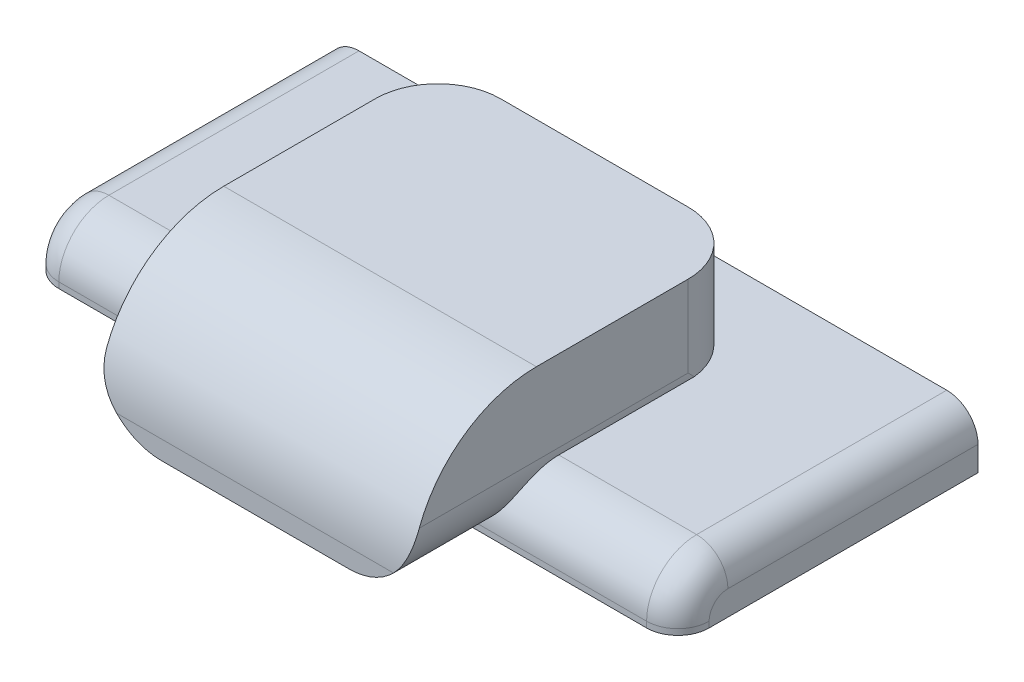
ISO-10303-21;
HEADER;
FILE_DESCRIPTION(('STEP AP214'),'2;1');
FILE_NAME('part.step','',(''),(''),'','','');
FILE_SCHEMA(('AUTOMOTIVE_DESIGN { 1 0 10303 214 1 1 1 1 }'));
ENDSEC;
DATA;
#1=APPLICATION_CONTEXT('core data for automotive mechanical design processes');
#2=APPLICATION_PROTOCOL_DEFINITION('international standard','automotive_design',2000,#1);
#3=PRODUCT_CONTEXT('',#1,'mechanical');
#4=PRODUCT('Part','Part','',(#3));
#5=PRODUCT_RELATED_PRODUCT_CATEGORY('part','',(#4));
#6=PRODUCT_DEFINITION_FORMATION('','',#4);
#7=PRODUCT_DEFINITION_CONTEXT('part definition',#1,'design');
#8=PRODUCT_DEFINITION('design','',#6,#7);
#9=PRODUCT_DEFINITION_SHAPE('','',#8);
#10=(LENGTH_UNIT() NAMED_UNIT(*) SI_UNIT(.MILLI.,.METRE.));
#11=(NAMED_UNIT(*) PLANE_ANGLE_UNIT() SI_UNIT($,.RADIAN.));
#12=(NAMED_UNIT(*) SI_UNIT($,.STERADIAN.) SOLID_ANGLE_UNIT());
#13=UNCERTAINTY_MEASURE_WITH_UNIT(LENGTH_MEASURE(1.E-05),#10,'distance_accuracy_value','');
#14=(GEOMETRIC_REPRESENTATION_CONTEXT(3) GLOBAL_UNCERTAINTY_ASSIGNED_CONTEXT((#13)) GLOBAL_UNIT_ASSIGNED_CONTEXT((#10,
#11,#12)) REPRESENTATION_CONTEXT('',''));
#15=CARTESIAN_POINT('',(0.,0.,0.));
#16=DIRECTION('',(0.,0.,1.));
#17=DIRECTION('',(1.,0.,0.));
#18=AXIS2_PLACEMENT_3D('',#15,#16,#17);
#19=CARTESIAN_POINT('',(3.175,2.921,3.444875));
#20=DIRECTION('',(-1.,0.,0.));
#21=DIRECTION('',(0.,0.,1.));
#22=AXIS2_PLACEMENT_3D('',#19,#20,#21);
#23=PLANE('',#22);
#24=DIRECTION('',(0.,0.,-1.));
#25=VECTOR('',#24,1.);
#26=CARTESIAN_POINT('',(3.175,1.27,1.4605));
#27=LINE('',#26,#25);
#28=CARTESIAN_POINT('',(3.175,1.27,3.28421923738979));
#29=VERTEX_POINT('',#28);
#30=CARTESIAN_POINT('',(3.175,1.27,-2.174875));
#31=VERTEX_POINT('',#30);
#32=EDGE_CURVE('E296',#29,#31,#27,.T.);
#33=ORIENTED_EDGE('',*,*,#32,.T.);
#34=DIRECTION('',(0.,-1.,0.));
#35=VECTOR('',#34,1.);
#36=CARTESIAN_POINT('',(3.175,2.921,-2.174875));
#37=LINE('',#36,#35);
#38=CARTESIAN_POINT('',(3.175,2.921,-2.174875));
#39=VERTEX_POINT('',#38);
#40=EDGE_CURVE('E443',#31,#39,#37,.F.);
#41=ORIENTED_EDGE('',*,*,#40,.T.);
#42=DIRECTION('',(0.,0.,-1.));
#43=VECTOR('',#42,1.);
#44=CARTESIAN_POINT('',(3.175,2.921,3.444875));
#45=LINE('',#44,#43);
#46=CARTESIAN_POINT('',(3.175,2.921,0.904875000000001));
#47=VERTEX_POINT('',#46);
#48=EDGE_CURVE('E274',#47,#39,#45,.T.);
#49=ORIENTED_EDGE('',*,*,#48,.F.);
#50=CARTESIAN_POINT('',(3.175,0.381,0.904875));
#51=DIRECTION('',(-1.,0.,0.));
#52=DIRECTION('',(0.,0.,1.));
#53=AXIS2_PLACEMENT_3D('',#50,#51,#52);
#54=CIRCLE('',#53,2.54);
#55=EDGE_CURVE('E287',#47,#29,#54,.F.);
#56=ORIENTED_EDGE('',*,*,#55,.T.);
#57=EDGE_LOOP('',(#33,#41,#49,#56));
#58=FACE_BOUND('',#57,.T.);
#59=ADVANCED_FACE('F37',(#58),#23,.F.);
#60=CARTESIAN_POINT('',(-3.175,2.921,-3.444875));
#61=DIRECTION('',(0.,0.,1.));
#62=DIRECTION('',(1.,0.,0.));
#63=AXIS2_PLACEMENT_3D('',#60,#61,#62);
#64=PLANE('',#63);
#65=DIRECTION('',(1.,0.,0.));
#66=VECTOR('',#65,1.);
#67=CARTESIAN_POINT('',(-3.175,1.1350625,-3.444875));
#68=LINE('',#67,#66);
#69=CARTESIAN_POINT('',(-1.905,1.1350625,-3.444875));
#70=VERTEX_POINT('',#69);
#71=CARTESIAN_POINT('',(1.905,1.1350625,-3.444875));
#72=VERTEX_POINT('',#71);
#73=EDGE_CURVE('E260',#70,#72,#68,.T.);
#74=ORIENTED_EDGE('',*,*,#73,.F.);
#75=DIRECTION('',(0.,-1.,0.));
#76=VECTOR('',#75,1.);
#77=CARTESIAN_POINT('',(-1.905,2.921,-3.444875));
#78=LINE('',#77,#76);
#79=CARTESIAN_POINT('',(-1.905,2.921,-3.444875));
#80=VERTEX_POINT('',#79);
#81=EDGE_CURVE('E451',#70,#80,#78,.F.);
#82=ORIENTED_EDGE('',*,*,#81,.T.);
#83=DIRECTION('',(-1.,0.,0.));
#84=VECTOR('',#83,1.);
#85=CARTESIAN_POINT('',(-3.175,2.921,-3.444875));
#86=LINE('',#85,#84);
#87=CARTESIAN_POINT('',(1.905,2.921,-3.444875));
#88=VERTEX_POINT('',#87);
#89=EDGE_CURVE('E277',#88,#80,#86,.T.);
#90=ORIENTED_EDGE('',*,*,#89,.F.);
#91=DIRECTION('',(0.,-1.,0.));
#92=VECTOR('',#91,1.);
#93=CARTESIAN_POINT('',(1.905,2.921,-3.444875));
#94=LINE('',#93,#92);
#95=EDGE_CURVE('E453',#88,#72,#94,.T.);
#96=ORIENTED_EDGE('',*,*,#95,.T.);
#97=EDGE_LOOP('',(#74,#82,#90,#96));
#98=FACE_BOUND('',#97,.T.);
#99=ADVANCED_FACE('F471',(#98),#64,.F.);
#100=CARTESIAN_POINT('',(-3.175,2.921,3.444875));
#101=DIRECTION('',(1.,0.,0.));
#102=DIRECTION('',(0.,0.,-1.));
#103=AXIS2_PLACEMENT_3D('',#100,#101,#102);
#104=PLANE('',#103);
#105=DIRECTION('',(0.,0.,1.));
#106=VECTOR('',#105,1.);
#107=CARTESIAN_POINT('',(-3.175,2.921,3.444875));
#108=LINE('',#107,#106);
#109=CARTESIAN_POINT('',(-3.175,2.921,-2.174875));
#110=VERTEX_POINT('',#109);
#111=CARTESIAN_POINT('',(-3.175,2.921,0.904875000000001));
#112=VERTEX_POINT('',#111);
#113=EDGE_CURVE('E280',#110,#112,#108,.T.);
#114=ORIENTED_EDGE('',*,*,#113,.F.);
#115=DIRECTION('',(0.,-1.,0.));
#116=VECTOR('',#115,1.);
#117=CARTESIAN_POINT('',(-3.175,2.921,-2.174875));
#118=LINE('',#117,#116);
#119=CARTESIAN_POINT('',(-3.175,1.27,-2.174875));
#120=VERTEX_POINT('',#119);
#121=EDGE_CURVE('E457',#110,#120,#118,.T.);
#122=ORIENTED_EDGE('',*,*,#121,.T.);
#123=DIRECTION('',(0.,0.,1.));
#124=VECTOR('',#123,1.);
#125=CARTESIAN_POINT('',(-3.175,1.27,3.444875));
#126=LINE('',#125,#124);
#127=CARTESIAN_POINT('',(-3.175,1.27,3.28421923738979));
#128=VERTEX_POINT('',#127);
#129=EDGE_CURVE('E485',#120,#128,#126,.T.);
#130=ORIENTED_EDGE('',*,*,#129,.T.);
#131=CARTESIAN_POINT('',(-3.175,0.381,0.904875));
#132=DIRECTION('',(1.,0.,0.));
#133=DIRECTION('',(0.,0.,-1.));
#134=AXIS2_PLACEMENT_3D('',#131,#132,#133);
#135=CIRCLE('',#134,2.54);
#136=EDGE_CURVE('E293',#128,#112,#135,.F.);
#137=ORIENTED_EDGE('',*,*,#136,.T.);
#138=EDGE_LOOP('',(#114,#122,#130,#137));
#139=FACE_BOUND('',#138,.T.);
#140=ADVANCED_FACE('F497',(#139),#104,.F.);
#141=CARTESIAN_POINT('',(-3.175,2.921,3.444875));
#142=DIRECTION('',(0.,0.,-1.));
#143=DIRECTION('',(-1.,0.,0.));
#144=AXIS2_PLACEMENT_3D('',#141,#142,#143);
#145=PLANE('',#144);
#146=DIRECTION('',(1.,0.,0.));
#147=VECTOR('',#146,1.);
#148=CARTESIAN_POINT('',(-3.175,0.,3.444875));
#149=LINE('',#148,#147);
#150=CARTESIAN_POINT('',(-1.905,0.,3.444875));
#151=VERTEX_POINT('',#150);
#152=CARTESIAN_POINT('',(1.905,0.,3.444875));
#153=VERTEX_POINT('',#152);
#154=EDGE_CURVE('E273',#151,#153,#149,.T.);
#155=ORIENTED_EDGE('',*,*,#154,.T.);
#156=CARTESIAN_POINT('',(1.905,1.27,3.444875));
#157=DIRECTION('',(0.,0.,-1.));
#158=DIRECTION('',(-1.,0.,0.));
#159=AXIS2_PLACEMENT_3D('',#156,#157,#158);
#160=CIRCLE('',#159,1.27);
#161=CARTESIAN_POINT('',(2.81196141042494,0.381,3.444875));
#162=VERTEX_POINT('',#161);
#163=EDGE_CURVE('E306',#153,#162,#160,.F.);
#164=ORIENTED_EDGE('',*,*,#163,.T.);
#165=DIRECTION('',(1.,0.,0.));
#166=VECTOR('',#165,1.);
#167=CARTESIAN_POINT('',(-3.175,0.381,3.444875));
#168=LINE('',#167,#166);
#169=CARTESIAN_POINT('',(-2.81196141042494,0.381,3.444875));
#170=VERTEX_POINT('',#169);
#171=EDGE_CURVE('E290',#162,#170,#168,.F.);
#172=ORIENTED_EDGE('',*,*,#171,.T.);
#173=CARTESIAN_POINT('',(-1.905,1.27,3.444875));
#174=DIRECTION('',(0.,0.,-1.));
#175=DIRECTION('',(-1.,0.,0.));
#176=AXIS2_PLACEMENT_3D('',#173,#174,#175);
#177=CIRCLE('',#176,1.27);
#178=EDGE_CURVE('E304',#170,#151,#177,.F.);
#179=ORIENTED_EDGE('',*,*,#178,.T.);
#180=EDGE_LOOP('',(#155,#164,#172,#179));
#181=FACE_BOUND('',#180,.T.);
#182=ADVANCED_FACE('F502',(#181),#145,.F.);
#183=CARTESIAN_POINT('',(3.175,2.921,-3.444875));
#184=DIRECTION('',(0.,-1.,0.));
#185=DIRECTION('',(0.,0.,-1.));
#186=AXIS2_PLACEMENT_3D('',#183,#184,#185);
#187=PLANE('',#186);
#188=ORIENTED_EDGE('',*,*,#89,.T.);
#189=CARTESIAN_POINT('',(-1.905,2.921,-2.174875));
#190=DIRECTION('',(0.,-1.,0.));
#191=DIRECTION('',(0.,0.,-1.));
#192=AXIS2_PLACEMENT_3D('',#189,#190,#191);
#193=CIRCLE('',#192,1.27);
#194=EDGE_CURVE('E447',#80,#110,#193,.F.);
#195=ORIENTED_EDGE('',*,*,#194,.T.);
#196=ORIENTED_EDGE('',*,*,#113,.T.);
#197=DIRECTION('',(1.,0.,0.));
#198=VECTOR('',#197,1.);
#199=CARTESIAN_POINT('',(3.175,2.921,0.904875));
#200=LINE('',#199,#198);
#201=EDGE_CURVE('E282',#112,#47,#200,.T.);
#202=ORIENTED_EDGE('',*,*,#201,.T.);
#203=ORIENTED_EDGE('',*,*,#48,.T.);
#204=CARTESIAN_POINT('',(1.905,2.921,-2.174875));
#205=DIRECTION('',(0.,-1.,0.));
#206=DIRECTION('',(0.,0.,-1.));
#207=AXIS2_PLACEMENT_3D('',#204,#205,#206);
#208=CIRCLE('',#207,1.27);
#209=EDGE_CURVE('E449',#39,#88,#208,.F.);
#210=ORIENTED_EDGE('',*,*,#209,.T.);
#211=EDGE_LOOP('',(#188,#195,#196,#202,#203,#210));
#212=FACE_BOUND('',#211,.T.);
#213=ADVANCED_FACE('F356',(#212),#187,.F.);
#214=CARTESIAN_POINT('',(3.175,0.,-3.444875));
#215=DIRECTION('',(0.,-1.,0.));
#216=DIRECTION('',(0.,0.,-1.));
#217=AXIS2_PLACEMENT_3D('',#214,#215,#216);
#218=PLANE('',#217);
#219=DIRECTION('',(0.,0.,1.));
#220=VECTOR('',#219,1.);
#221=CARTESIAN_POINT('',(1.27,0.,-2.159));
#222=LINE('',#221,#220);
#223=CARTESIAN_POINT('',(1.27,0.,-2.159));
#224=VERTEX_POINT('',#223);
#225=CARTESIAN_POINT('',(1.27,0.,-0.253999999999999));
#226=VERTEX_POINT('',#225);
#227=EDGE_CURVE('E54',#224,#226,#222,.T.);
#228=ORIENTED_EDGE('',*,*,#227,.F.);
#229=DIRECTION('',(1.,0.,0.));
#230=VECTOR('',#229,1.);
#231=CARTESIAN_POINT('',(-1.27,0.,-2.159));
#232=LINE('',#231,#230);
#233=CARTESIAN_POINT('',(-1.27,0.,-2.159));
#234=VERTEX_POINT('',#233);
#235=EDGE_CURVE('E226',#234,#224,#232,.T.);
#236=ORIENTED_EDGE('',*,*,#235,.F.);
#237=DIRECTION('',(0.,0.,-1.));
#238=VECTOR('',#237,1.);
#239=CARTESIAN_POINT('',(-1.27,0.,-2.159));
#240=LINE('',#239,#238);
#241=CARTESIAN_POINT('',(-1.27,0.,-0.254));
#242=VERTEX_POINT('',#241);
#243=EDGE_CURVE('E229',#242,#234,#240,.T.);
#244=ORIENTED_EDGE('',*,*,#243,.F.);
#245=DIRECTION('',(-1.,0.,0.));
#246=VECTOR('',#245,1.);
#247=CARTESIAN_POINT('',(-1.27,0.,-0.254));
#248=LINE('',#247,#246);
#249=EDGE_CURVE('E235',#226,#242,#248,.T.);
#250=ORIENTED_EDGE('',*,*,#249,.F.);
#251=EDGE_LOOP('',(#228,#236,#244,#250));
#252=FACE_BOUND('',#251,.T.);
#253=DIRECTION('',(0.,0.,1.));
#254=VECTOR('',#253,1.);
#255=CARTESIAN_POINT('',(6.604,0.,-0.595312499999999));
#256=LINE('',#255,#254);
#257=CARTESIAN_POINT('',(6.604,0.,-4.6355));
#258=VERTEX_POINT('',#257);
#259=CARTESIAN_POINT('',(6.604,0.,0.8255));
#260=VERTEX_POINT('',#259);
#261=EDGE_CURVE('E254',#258,#260,#256,.T.);
#262=ORIENTED_EDGE('',*,*,#261,.T.);
#263=CARTESIAN_POINT('',(5.969,0.,0.8255));
#264=DIRECTION('',(0.,-1.,0.));
#265=DIRECTION('',(0.,0.,-1.));
#266=AXIS2_PLACEMENT_3D('',#263,#264,#265);
#267=CIRCLE('',#266,0.635);
#268=CARTESIAN_POINT('',(5.969,0.,1.4605));
#269=VERTEX_POINT('',#268);
#270=EDGE_CURVE('E428',#260,#269,#267,.T.);
#271=ORIENTED_EDGE('',*,*,#270,.T.);
#272=DIRECTION('',(-1.,0.,0.));
#273=VECTOR('',#272,1.);
#274=CARTESIAN_POINT('',(6.604,0.,1.4605));
#275=LINE('',#274,#273);
#276=CARTESIAN_POINT('',(1.905,0.,1.4605));
#277=VERTEX_POINT('',#276);
#278=EDGE_CURVE('E262',#269,#277,#275,.T.);
#279=ORIENTED_EDGE('',*,*,#278,.T.);
#280=DIRECTION('',(0.,0.,-1.));
#281=VECTOR('',#280,1.);
#282=CARTESIAN_POINT('',(1.905,0.,3.444875));
#283=LINE('',#282,#281);
#284=EDGE_CURVE('E302',#277,#153,#283,.F.);
#285=ORIENTED_EDGE('',*,*,#284,.T.);
#286=ORIENTED_EDGE('',*,*,#154,.F.);
#287=DIRECTION('',(0.,0.,1.));
#288=VECTOR('',#287,1.);
#289=CARTESIAN_POINT('',(-1.905,0.,1.4605));
#290=LINE('',#289,#288);
#291=CARTESIAN_POINT('',(-1.905,0.,1.4605));
#292=VERTEX_POINT('',#291);
#293=EDGE_CURVE('E299',#151,#292,#290,.F.);
#294=ORIENTED_EDGE('',*,*,#293,.T.);
#295=CARTESIAN_POINT('',(-5.969,0.,1.4605));
#296=VERTEX_POINT('',#295);
#297=EDGE_CURVE('E264',#292,#296,#275,.T.);
#298=ORIENTED_EDGE('',*,*,#297,.T.);
#299=CARTESIAN_POINT('',(-5.969,0.,0.8255));
#300=DIRECTION('',(0.,-1.,0.));
#301=DIRECTION('',(0.,0.,-1.));
#302=AXIS2_PLACEMENT_3D('',#299,#300,#301);
#303=CIRCLE('',#302,0.635);
#304=CARTESIAN_POINT('',(-6.604,0.,0.8255));
#305=VERTEX_POINT('',#304);
#306=EDGE_CURVE('E430',#296,#305,#303,.T.);
#307=ORIENTED_EDGE('',*,*,#306,.T.);
#308=DIRECTION('',(0.,0.,1.));
#309=VECTOR('',#308,1.);
#310=CARTESIAN_POINT('',(-6.604,0.,-0.595312499999999));
#311=LINE('',#310,#309);
#312=CARTESIAN_POINT('',(-6.604,0.,-4.6355));
#313=VERTEX_POINT('',#312);
#314=EDGE_CURVE('E247',#313,#305,#311,.T.);
#315=ORIENTED_EDGE('',*,*,#314,.F.);
#316=DIRECTION('',(-1.,0.,0.));
#317=VECTOR('',#316,1.);
#318=CARTESIAN_POINT('',(6.604,0.,-4.6355));
#319=LINE('',#318,#317);
#320=EDGE_CURVE('E265',#258,#313,#319,.T.);
#321=ORIENTED_EDGE('',*,*,#320,.F.);
#322=EDGE_LOOP('',(#262,#271,#279,#285,#286,#294,#298,#307,#315,#321));
#323=FACE_BOUND('',#322,.T.);
#324=ADVANCED_FACE('F505',(#252,#323),#218,.T.);
#325=CARTESIAN_POINT('',(3.175,0.381,0.904875));
#326=DIRECTION('',(1.,0.,0.));
#327=DIRECTION('',(0.,0.,-1.));
#328=AXIS2_PLACEMENT_3D('',#325,#326,#327);
#329=CYLINDRICAL_SURFACE('',#328,2.54);
#330=ORIENTED_EDGE('',*,*,#171,.F.);
#331=CARTESIAN_POINT('',(2.81196141042494,0.381,3.444875));
#332=CARTESIAN_POINT('',(2.83530265640108,0.404812761778381,3.44487475657416));
#333=CARTESIAN_POINT('',(2.85769597607239,0.429536249409174,3.44453958356197));
#334=CARTESIAN_POINT('',(2.9004644606015,0.480656733278885,3.44304842516482));
#335=CARTESIAN_POINT('',(2.92083916791631,0.507054106710751,3.44189225417354));
#336=CARTESIAN_POINT('',(2.97867249169467,0.588428013788455,3.4369713428115));
#337=CARTESIAN_POINT('',(3.01291869293234,0.645666477866478,3.43175520076263));
#338=CARTESIAN_POINT('',(3.07190278763874,0.764383396622853,3.41648975171774));
#339=CARTESIAN_POINT('',(3.09661898717168,0.825871153788977,3.40642953335771));
#340=CARTESIAN_POINT('',(3.13598970297873,0.950867973850992,3.38094083572259));
#341=CARTESIAN_POINT('',(3.15065667979951,1.01437443098801,3.36551904045836));
#342=CARTESIAN_POINT('',(3.16530999089424,1.11003603405112,3.33823465281124));
#343=CARTESIAN_POINT('',(3.16896879325374,1.14225093165592,3.32835118330381));
#344=CARTESIAN_POINT('',(3.1738123783697,1.20638673632545,3.30726463634275));
#345=CARTESIAN_POINT('',(3.17500048482442,1.23830798076214,3.29606335314948));
#346=CARTESIAN_POINT('',(3.17500000000007,1.26999999999999,3.2842192373898));
#347=B_SPLINE_CURVE_WITH_KNOTS('',3,(#331,#332,#333,#334,#335,#336,#337,#338,#339,#340,#341,
#342,#343,#344,#345,#346),.UNSPECIFIED.,.F.,.F.,(4,2,2,2,2,2,2,4),(0.,0.0999781975542164,
0.199979004782717,0.399648454892925,0.599769782894258,0.799642518934599,0.901226248802202,
1.00267323474239),.UNSPECIFIED.);
#348=EDGE_CURVE('E315',#162,#29,#347,.T.);
#349=ORIENTED_EDGE('',*,*,#348,.T.);
#350=ORIENTED_EDGE('',*,*,#55,.F.);
#351=ORIENTED_EDGE('',*,*,#201,.F.);
#352=ORIENTED_EDGE('',*,*,#136,.F.);
#353=CARTESIAN_POINT('',(-3.175,1.27,3.28421923738979));
#354=CARTESIAN_POINT('',(-3.17500028939576,1.23877064928272,3.29589018244918));
#355=CARTESIAN_POINT('',(-3.17384678915355,1.20731923227252,3.3069371503879));
#356=CARTESIAN_POINT('',(-3.16914751453646,1.14416058554834,3.32774330593213));
#357=CARTESIAN_POINT('',(-3.16560101447546,1.11245328111828,3.337502101821));
#358=CARTESIAN_POINT('',(-3.15126484451605,1.01738449302599,3.36474039872442));
#359=CARTESIAN_POINT('',(-3.13677915469864,0.953950936402316,3.38022834337533));
#360=CARTESIAN_POINT('',(-3.09777313865737,0.828984841127505,3.40587476096027));
#361=CARTESIAN_POINT('',(-3.07322859288555,0.767457278988717,3.41602023471697));
#362=CARTESIAN_POINT('',(-3.01454697200749,0.648559403482906,3.43145367473181));
#363=CARTESIAN_POINT('',(-2.98042091025994,0.591184411673415,3.4367471883998));
#364=CARTESIAN_POINT('',(-2.92244026287935,0.509166124848098,3.4417919053584));
#365=CARTESIAN_POINT('',(-2.90177664553235,0.482290820593465,3.4429883223159));
#366=CARTESIAN_POINT('',(-2.85838628733226,0.430298800497095,3.44452917652487));
#367=CARTESIAN_POINT('',(-2.83566252649516,0.405179634742667,3.44487482466013));
#368=CARTESIAN_POINT('',(-2.81196141042494,0.381,3.444875));
#369=B_SPLINE_CURVE_WITH_KNOTS('',3,(#353,#354,#355,#356,#357,#358,#359,#360,#361,#362,#363,
#364,#365,#366,#367,#368),.UNSPECIFIED.,.F.,.F.,(4,2,2,2,2,2,2,4),(0.,0.0999661182620468,
0.199962565255415,0.399559714249969,0.599640300215819,0.799491840897593,0.901155092749359,
1.002673565258),.UNSPECIFIED.);
#370=EDGE_CURVE('E308',#128,#170,#369,.T.);
#371=ORIENTED_EDGE('',*,*,#370,.T.);
#372=EDGE_LOOP('',(#330,#349,#350,#351,#352,#371));
#373=FACE_BOUND('',#372,.T.);
#374=ADVANCED_FACE('F321',(#373),#329,.T.);
#375=CARTESIAN_POINT('',(6.604,0.119062499999999,0.4445));
#376=DIRECTION('',(-1.,0.,0.));
#377=DIRECTION('',(0.,0.,1.));
#378=AXIS2_PLACEMENT_3D('',#375,#376,#377);
#379=CYLINDRICAL_SURFACE('',#378,1.016);
#380=DIRECTION('',(-1.,0.,0.));
#381=VECTOR('',#380,1.);
#382=CARTESIAN_POINT('',(6.604,0.119062499999999,1.4605));
#383=LINE('',#382,#381);
#384=CARTESIAN_POINT('',(5.969,0.119062499999999,1.4605));
#385=VERTEX_POINT('',#384);
#386=CARTESIAN_POINT('',(2.44188254869547,0.119062499999999,1.4605));
#387=VERTEX_POINT('',#386);
#388=EDGE_CURVE('E258',#385,#387,#383,.T.);
#389=ORIENTED_EDGE('',*,*,#388,.F.);
#390=CARTESIAN_POINT('',(5.969,0.119062499999999,0.4445));
#391=DIRECTION('',(-1.,0.,0.));
#392=DIRECTION('',(0.,0.,1.));
#393=AXIS2_PLACEMENT_3D('',#390,#391,#392);
#394=CIRCLE('',#393,1.016);
#395=CARTESIAN_POINT('',(5.969,1.1350625,0.4445));
#396=VERTEX_POINT('',#395);
#397=EDGE_CURVE('E422',#385,#396,#394,.T.);
#398=ORIENTED_EDGE('',*,*,#397,.T.);
#399=DIRECTION('',(-1.,0.,0.));
#400=VECTOR('',#399,1.);
#401=CARTESIAN_POINT('',(6.604,1.1350625,0.4445));
#402=LINE('',#401,#400);
#403=CARTESIAN_POINT('',(3.16781109873716,1.1350625,0.4445));
#404=VERTEX_POINT('',#403);
#405=EDGE_CURVE('E269',#396,#404,#402,.T.);
#406=ORIENTED_EDGE('',*,*,#405,.T.);
#407=CARTESIAN_POINT('',(3.16781109873716,1.1350625,0.4445));
#408=CARTESIAN_POINT('',(3.16780588949168,1.13506229735339,0.472513139473024));
#409=CARTESIAN_POINT('',(3.16768782557074,1.13390316615151,0.500513145677965));
#410=CARTESIAN_POINT('',(3.16718282275119,1.12927882387294,0.556320662673326));
#411=CARTESIAN_POINT('',(3.16679587309761,1.12581352055354,0.584128165719013));
#412=CARTESIAN_POINT('',(3.16516636405337,1.1119711522942,0.667039178087049));
#413=CARTESIAN_POINT('',(3.16345505633165,1.09814765359484,0.721600415189948));
#414=CARTESIAN_POINT('',(3.15793879959272,1.06171961576294,0.827650039020477));
#415=CARTESIAN_POINT('',(3.15413139242906,1.03910477598082,0.879134739084068));
#416=CARTESIAN_POINT('',(3.1431121072053,0.98590029165393,0.977379414626809));
#417=CARTESIAN_POINT('',(3.13590361770318,0.955318598177004,1.02414403663227));
#418=CARTESIAN_POINT('',(3.11686452284432,0.888631477146278,1.10998778321032));
#419=CARTESIAN_POINT('',(3.10519547539781,0.852743380215111,1.14927066244889));
#420=CARTESIAN_POINT('',(3.07594912949868,0.77661219141164,1.2207767721841));
#421=CARTESIAN_POINT('',(3.05837592141962,0.736372127612632,1.25300486474303));
#422=CARTESIAN_POINT('',(3.01835184704419,0.657520960980778,1.30729448643075));
#423=CARTESIAN_POINT('',(2.99644906516663,0.619066469037416,1.329991180583));
#424=CARTESIAN_POINT('',(2.94702631917585,0.542571174737475,1.36902218851522));
#425=CARTESIAN_POINT('',(2.91950737524619,0.504530298567031,1.38535765625568));
#426=CARTESIAN_POINT('',(2.85943309478112,0.430828477439238,1.41227773519015));
#427=CARTESIAN_POINT('',(2.82690328667999,0.395156712605033,1.42289033285059));
#428=CARTESIAN_POINT('',(2.7573385317759,0.327244326258124,1.43955860844835));
#429=CARTESIAN_POINT('',(2.72029687894707,0.295008948990391,1.44560740473247));
#430=CARTESIAN_POINT('',(2.64436504204632,0.236351731623509,1.45412343176583));
#431=CARTESIAN_POINT('',(2.60564832343234,0.209725418575293,1.45674830329747));
#432=CARTESIAN_POINT('',(2.5256012205689,0.160966036453146,1.45992283139009));
#433=CARTESIAN_POINT('',(2.48428151583222,0.13881599971835,1.46048046897763));
#434=CARTESIAN_POINT('',(2.44188254869547,0.119062499999999,1.4605));
#435=B_SPLINE_CURVE_WITH_KNOTS('',3,(#407,#408,#409,#410,#411,#412,#413,#414,#415,#416,#417,
#418,#419,#420,#421,#422,#423,#424,#425,#426,#427,#428,#429,#430,#431,#432,#433,#434),
.UNSPECIFIED.,.F.,.F.,(4,2,2,2,2,2,2,2,2,2,2,2,2,4),(0.,0.083988959821383,0.167981279251459,
0.336057098907809,0.504330446309191,0.67243649291429,0.834956205905998,0.997363557414874,
1.14583196118275,1.29427341942759,1.44198221744291,1.58991329953488,1.73076034479152,
1.8710630483217),.UNSPECIFIED.);
#436=EDGE_CURVE('E360',#404,#387,#435,.T.);
#437=ORIENTED_EDGE('',*,*,#436,.T.);
#438=EDGE_LOOP('',(#389,#398,#406,#437));
#439=FACE_BOUND('',#438,.T.);
#440=ADVANCED_FACE('F347',(#439),#379,.T.);
#441=CARTESIAN_POINT('',(-3.16781109873716,1.1350625,0.4445));
#442=VERTEX_POINT('',#441);
#443=CARTESIAN_POINT('',(-5.969,1.1350625,0.4445));
#444=VERTEX_POINT('',#443);
#445=EDGE_CURVE('E257',#442,#444,#402,.T.);
#446=ORIENTED_EDGE('',*,*,#445,.T.);
#447=CARTESIAN_POINT('',(-5.969,0.119062499999999,0.4445));
#448=DIRECTION('',(-1.,0.,0.));
#449=DIRECTION('',(0.,0.,1.));
#450=AXIS2_PLACEMENT_3D('',#447,#448,#449);
#451=CIRCLE('',#450,1.016);
#452=CARTESIAN_POINT('',(-5.969,0.119062499999999,1.4605));
#453=VERTEX_POINT('',#452);
#454=EDGE_CURVE('E390',#444,#453,#451,.F.);
#455=ORIENTED_EDGE('',*,*,#454,.T.);
#456=CARTESIAN_POINT('',(-2.44188254869547,0.119062499999999,1.4605));
#457=VERTEX_POINT('',#456);
#458=EDGE_CURVE('E261',#457,#453,#383,.T.);
#459=ORIENTED_EDGE('',*,*,#458,.F.);
#460=CARTESIAN_POINT('',(-2.44188254869547,0.119062499999999,1.4605));
#461=CARTESIAN_POINT('',(-2.47009855106913,0.132225904226144,1.46049506163652));
#462=CARTESIAN_POINT('',(-2.49781977733512,0.146420809685958,1.46024406481651));
#463=CARTESIAN_POINT('',(-2.55215785426478,0.176812292519377,1.45897282541728));
#464=CARTESIAN_POINT('',(-2.57877361019427,0.193010793738471,1.45795183862712));
#465=CARTESIAN_POINT('',(-2.65693187957126,0.244625115192226,1.45330449041474));
#466=CARTESIAN_POINT('',(-2.70654097410849,0.282945663254271,1.44808898980251));
#467=CARTESIAN_POINT('',(-2.79184022231365,0.359408897208896,1.43230902382728));
#468=CARTESIAN_POINT('',(-2.82849733921843,0.396669955666617,1.4226921143469));
#469=CARTESIAN_POINT('',(-2.89599298100913,0.474100616985646,1.39731374388612));
#470=CARTESIAN_POINT('',(-2.92684932406138,0.51426077067644,1.38157157082493));
#471=CARTESIAN_POINT('',(-2.9823971720119,0.595786697428854,1.34285078632723));
#472=CARTESIAN_POINT('',(-3.00705124959924,0.637158183501514,1.31983004877902));
#473=CARTESIAN_POINT('',(-3.04989964745304,0.718438307689764,1.26630915077827));
#474=CARTESIAN_POINT('',(-3.06808977915872,0.758345982309844,1.23580416217886));
#475=CARTESIAN_POINT('',(-3.09731198190146,0.831025979936272,1.17081698800315));
#476=CARTESIAN_POINT('',(-3.1088248862742,0.864116770708075,1.13690193988746));
#477=CARTESIAN_POINT('',(-3.12785250299705,0.925658696857507,1.0641212407795));
#478=CARTESIAN_POINT('',(-3.13536697762946,0.954109556308683,1.02525529561294));
#479=CARTESIAN_POINT('',(-3.14767497813791,1.00652423468055,0.94170219510907));
#480=CARTESIAN_POINT('',(-3.15232975551628,1.03022626334596,0.89683104864001));
#481=CARTESIAN_POINT('',(-3.15943651859764,1.07072304545656,0.803901416947586));
#482=CARTESIAN_POINT('',(-3.16188778880258,1.08751555436115,0.755841901868522));
#483=CARTESIAN_POINT('',(-3.16519374536976,1.11204129776499,0.664055606165502));
#484=CARTESIAN_POINT('',(-3.16621352632139,1.12066337592886,0.620569049665078));
#485=CARTESIAN_POINT('',(-3.16750207932268,1.1321788056369,0.532890131337707));
#486=CARTESIAN_POINT('',(-3.16777182082655,1.13507955080759,0.488698754934408));
#487=CARTESIAN_POINT('',(-3.16781109873716,1.1350625,0.4445));
#488=B_SPLINE_CURVE_WITH_KNOTS('',3,(#460,#461,#462,#463,#464,#465,#466,#467,#468,#469,#470,
#471,#472,#473,#474,#475,#476,#477,#478,#479,#480,#481,#482,#483,#484,#485,#486,#487),
.UNSPECIFIED.,.F.,.F.,(4,2,2,2,2,2,2,2,2,2,2,2,2,4),(0.,0.0933567559847732,0.186803858991217,
0.374498562149862,0.533284921388177,0.691575270804067,0.850799064303996,1.01012584561012,
1.15575944470449,1.30140170115142,1.4536445118608,1.605936739304,1.73859481974314,
1.87108135473701),.UNSPECIFIED.);
#489=EDGE_CURVE('E335',#457,#442,#488,.T.);
#490=ORIENTED_EDGE('',*,*,#489,.T.);
#491=EDGE_LOOP('',(#446,#455,#459,#490));
#492=FACE_BOUND('',#491,.T.);
#493=ADVANCED_FACE('F352',(#492),#379,.T.);
#494=CARTESIAN_POINT('',(6.604,1.1350625,-0.595312499999999));
#495=DIRECTION('',(0.,-1.,0.));
#496=DIRECTION('',(0.,0.,-1.));
#497=AXIS2_PLACEMENT_3D('',#494,#495,#496);
#498=PLANE('',#497);
#499=ORIENTED_EDGE('',*,*,#405,.F.);
#500=DIRECTION('',(0.,0.,1.));
#501=VECTOR('',#500,1.);
#502=CARTESIAN_POINT('',(5.969,1.1350625,-0.595312499999999));
#503=LINE('',#502,#501);
#504=CARTESIAN_POINT('',(5.969,1.1350625,-4.6355));
#505=VERTEX_POINT('',#504);
#506=EDGE_CURVE('E396',#396,#505,#503,.F.);
#507=ORIENTED_EDGE('',*,*,#506,.T.);
#508=DIRECTION('',(-1.,0.,0.));
#509=VECTOR('',#508,1.);
#510=CARTESIAN_POINT('',(6.604,1.1350625,-4.6355));
#511=LINE('',#510,#509);
#512=CARTESIAN_POINT('',(-5.969,1.1350625,-4.6355));
#513=VERTEX_POINT('',#512);
#514=EDGE_CURVE('E267',#505,#513,#511,.T.);
#515=ORIENTED_EDGE('',*,*,#514,.T.);
#516=DIRECTION('',(0.,0.,1.));
#517=VECTOR('',#516,1.);
#518=CARTESIAN_POINT('',(-5.969,1.1350625,0.4445));
#519=LINE('',#518,#517);
#520=EDGE_CURVE('E393',#513,#444,#519,.T.);
#521=ORIENTED_EDGE('',*,*,#520,.T.);
#522=ORIENTED_EDGE('',*,*,#445,.F.);
#523=DIRECTION('',(0.,0.,-1.));
#524=VECTOR('',#523,1.);
#525=CARTESIAN_POINT('',(-3.16781109873716,1.1350625,0.4445));
#526=LINE('',#525,#524);
#527=CARTESIAN_POINT('',(-3.16781109873716,1.1350625,-2.3098125));
#528=VERTEX_POINT('',#527);
#529=EDGE_CURVE('E343',#442,#528,#526,.T.);
#530=ORIENTED_EDGE('',*,*,#529,.T.);
#531=CARTESIAN_POINT('',(-1.905,1.1350625,-2.174875));
#532=DIRECTION('',(0.,-1.,0.));
#533=DIRECTION('',(0.,0.,-1.));
#534=AXIS2_PLACEMENT_3D('',#531,#532,#533);
#535=CIRCLE('',#534,1.27);
#536=EDGE_CURVE('E441',#528,#70,#535,.T.);
#537=ORIENTED_EDGE('',*,*,#536,.T.);
#538=ORIENTED_EDGE('',*,*,#73,.T.);
#539=CARTESIAN_POINT('',(1.905,1.1350625,-2.174875));
#540=DIRECTION('',(0.,-1.,0.));
#541=DIRECTION('',(0.,0.,-1.));
#542=AXIS2_PLACEMENT_3D('',#539,#540,#541);
#543=CIRCLE('',#542,1.27);
#544=CARTESIAN_POINT('',(3.16781109873716,1.1350625,-2.3098125));
#545=VERTEX_POINT('',#544);
#546=EDGE_CURVE('E439',#72,#545,#543,.T.);
#547=ORIENTED_EDGE('',*,*,#546,.T.);
#548=DIRECTION('',(0.,0.,1.));
#549=VECTOR('',#548,1.);
#550=CARTESIAN_POINT('',(3.16781109873716,1.1350625,-3.444875));
#551=LINE('',#550,#549);
#552=EDGE_CURVE('E367',#545,#404,#551,.T.);
#553=ORIENTED_EDGE('',*,*,#552,.T.);
#554=EDGE_LOOP('',(#499,#507,#515,#521,#522,#530,#537,#538,#547,#553));
#555=FACE_BOUND('',#554,.T.);
#556=ADVANCED_FACE('F354',(#555),#498,.F.);
#557=CARTESIAN_POINT('',(6.604,-5.36403022786869,1.46050000000002));
#558=DIRECTION('',(0.,0.,-1.));
#559=DIRECTION('',(0.,1.,0.));
#560=AXIS2_PLACEMENT_3D('',#557,#558,#559);
#561=PLANE('',#560);
#562=ORIENTED_EDGE('',*,*,#278,.F.);
#563=DIRECTION('',(0.,-1.,0.));
#564=VECTOR('',#563,1.);
#565=CARTESIAN_POINT('',(5.969,-5.36403022786869,1.46050000000002));
#566=LINE('',#565,#564);
#567=EDGE_CURVE('E426',#269,#385,#566,.F.);
#568=ORIENTED_EDGE('',*,*,#567,.T.);
#569=ORIENTED_EDGE('',*,*,#388,.T.);
#570=CARTESIAN_POINT('',(1.905,1.27,1.4605));
#571=DIRECTION('',(0.,0.,-1.));
#572=DIRECTION('',(0.,1.,0.));
#573=AXIS2_PLACEMENT_3D('',#570,#571,#572);
#574=CIRCLE('',#573,1.27);
#575=EDGE_CURVE('E366',#387,#277,#574,.T.);
#576=ORIENTED_EDGE('',*,*,#575,.T.);
#577=EDGE_LOOP('',(#562,#568,#569,#576));
#578=FACE_BOUND('',#577,.T.);
#579=ADVANCED_FACE('F527',(#578),#561,.F.);
#580=ORIENTED_EDGE('',*,*,#458,.T.);
#581=DIRECTION('',(0.,-1.,0.));
#582=VECTOR('',#581,1.);
#583=CARTESIAN_POINT('',(-5.969,0.,1.4605));
#584=LINE('',#583,#582);
#585=EDGE_CURVE('E420',#453,#296,#584,.T.);
#586=ORIENTED_EDGE('',*,*,#585,.T.);
#587=ORIENTED_EDGE('',*,*,#297,.F.);
#588=CARTESIAN_POINT('',(-1.905,1.27,1.4605));
#589=DIRECTION('',(0.,0.,-1.));
#590=DIRECTION('',(0.,1.,0.));
#591=AXIS2_PLACEMENT_3D('',#588,#589,#590);
#592=CIRCLE('',#591,1.27);
#593=EDGE_CURVE('E344',#292,#457,#592,.T.);
#594=ORIENTED_EDGE('',*,*,#593,.T.);
#595=EDGE_LOOP('',(#580,#586,#587,#594));
#596=FACE_BOUND('',#595,.T.);
#597=ADVANCED_FACE('F378',(#596),#561,.F.);
#598=CARTESIAN_POINT('',(6.604,-5.36403022786869,-4.6355));
#599=DIRECTION('',(0.,0.,1.));
#600=DIRECTION('',(0.,-1.,0.));
#601=AXIS2_PLACEMENT_3D('',#598,#599,#600);
#602=PLANE('',#601);
#603=ORIENTED_EDGE('',*,*,#514,.F.);
#604=CARTESIAN_POINT('',(5.969,0.500062499999999,-4.6355));
#605=DIRECTION('',(0.,0.,1.));
#606=DIRECTION('',(0.,-1.,0.));
#607=AXIS2_PLACEMENT_3D('',#604,#605,#606);
#608=CIRCLE('',#607,0.635);
#609=CARTESIAN_POINT('',(6.604,0.500062499999999,-4.6355));
#610=VERTEX_POINT('',#609);
#611=EDGE_CURVE('E11',#505,#610,#608,.F.);
#612=ORIENTED_EDGE('',*,*,#611,.T.);
#613=DIRECTION('',(0.,1.,0.));
#614=VECTOR('',#613,1.);
#615=CARTESIAN_POINT('',(6.604,-5.36403022786869,-4.6355));
#616=LINE('',#615,#614);
#617=EDGE_CURVE('E251',#258,#610,#616,.T.);
#618=ORIENTED_EDGE('',*,*,#617,.F.);
#619=ORIENTED_EDGE('',*,*,#320,.T.);
#620=DIRECTION('',(0.,1.,0.));
#621=VECTOR('',#620,1.);
#622=CARTESIAN_POINT('',(-6.604,-5.36403022786869,-4.6355));
#623=LINE('',#622,#621);
#624=CARTESIAN_POINT('',(-6.604,0.500062499999999,-4.6355));
#625=VERTEX_POINT('',#624);
#626=EDGE_CURVE('E245',#313,#625,#623,.T.);
#627=ORIENTED_EDGE('',*,*,#626,.T.);
#628=CARTESIAN_POINT('',(-5.969,0.500062499999999,-4.6355));
#629=DIRECTION('',(0.,0.,1.));
#630=DIRECTION('',(0.,-1.,0.));
#631=AXIS2_PLACEMENT_3D('',#628,#629,#630);
#632=CIRCLE('',#631,0.635);
#633=EDGE_CURVE('E46',#625,#513,#632,.F.);
#634=ORIENTED_EDGE('',*,*,#633,.T.);
#635=EDGE_LOOP('',(#603,#612,#618,#619,#627,#634));
#636=FACE_BOUND('',#635,.T.);
#637=ADVANCED_FACE('F536',(#636),#602,.F.);
#638=CARTESIAN_POINT('',(6.604,-5.36403022786869,-0.595312499999999));
#639=DIRECTION('',(-1.,0.,0.));
#640=DIRECTION('',(0.,0.,1.));
#641=AXIS2_PLACEMENT_3D('',#638,#639,#640);
#642=PLANE('',#641);
#643=CARTESIAN_POINT('',(6.604,0.119062499999999,0.4445));
#644=DIRECTION('',(-1.,0.,0.));
#645=DIRECTION('',(0.,0.,1.));
#646=AXIS2_PLACEMENT_3D('',#643,#644,#645);
#647=CIRCLE('',#646,0.381);
#648=CARTESIAN_POINT('',(6.604,0.500062499999999,0.4445));
#649=VERTEX_POINT('',#648);
#650=CARTESIAN_POINT('',(6.604,0.119062499999997,0.8255));
#651=VERTEX_POINT('',#650);
#652=EDGE_CURVE('E435',#649,#651,#647,.F.);
#653=ORIENTED_EDGE('',*,*,#652,.T.);
#654=DIRECTION('',(0.,-1.,0.));
#655=VECTOR('',#654,1.);
#656=CARTESIAN_POINT('',(6.604,-5.36403022786869,0.825500000000019));
#657=LINE('',#656,#655);
#658=EDGE_CURVE('E432',#651,#260,#657,.T.);
#659=ORIENTED_EDGE('',*,*,#658,.T.);
#660=ORIENTED_EDGE('',*,*,#261,.F.);
#661=ORIENTED_EDGE('',*,*,#617,.T.);
#662=DIRECTION('',(0.,0.,1.));
#663=VECTOR('',#662,1.);
#664=CARTESIAN_POINT('',(6.604,0.500062499999999,-0.595312499999999));
#665=LINE('',#664,#663);
#666=EDGE_CURVE('E437',#610,#649,#665,.T.);
#667=ORIENTED_EDGE('',*,*,#666,.T.);
#668=EDGE_LOOP('',(#653,#659,#660,#661,#667));
#669=FACE_BOUND('',#668,.T.);
#670=ADVANCED_FACE('F518',(#669),#642,.F.);
#671=CARTESIAN_POINT('',(-6.604,-5.36403022786869,-0.595312499999999));
#672=DIRECTION('',(-1.,0.,0.));
#673=DIRECTION('',(0.,0.,1.));
#674=AXIS2_PLACEMENT_3D('',#671,#672,#673);
#675=PLANE('',#674);
#676=ORIENTED_EDGE('',*,*,#314,.T.);
#677=DIRECTION('',(0.,-1.,0.));
#678=VECTOR('',#677,1.);
#679=CARTESIAN_POINT('',(-6.604,0.119062499999997,0.8255));
#680=LINE('',#679,#678);
#681=CARTESIAN_POINT('',(-6.604,0.119062499999997,0.8255));
#682=VERTEX_POINT('',#681);
#683=EDGE_CURVE('E394',#305,#682,#680,.F.);
#684=ORIENTED_EDGE('',*,*,#683,.T.);
#685=CARTESIAN_POINT('',(-6.604,0.119062499999999,0.4445));
#686=DIRECTION('',(-1.,0.,0.));
#687=DIRECTION('',(0.,0.,1.));
#688=AXIS2_PLACEMENT_3D('',#685,#686,#687);
#689=CIRCLE('',#688,0.381);
#690=CARTESIAN_POINT('',(-6.604,0.500062499999999,0.4445));
#691=VERTEX_POINT('',#690);
#692=EDGE_CURVE('E398',#682,#691,#689,.T.);
#693=ORIENTED_EDGE('',*,*,#692,.T.);
#694=DIRECTION('',(0.,0.,1.));
#695=VECTOR('',#694,1.);
#696=CARTESIAN_POINT('',(-6.604,0.500062499999999,-4.6355));
#697=LINE('',#696,#695);
#698=EDGE_CURVE('E417',#691,#625,#697,.F.);
#699=ORIENTED_EDGE('',*,*,#698,.T.);
#700=ORIENTED_EDGE('',*,*,#626,.F.);
#701=EDGE_LOOP('',(#676,#684,#693,#699,#700));
#702=FACE_BOUND('',#701,.T.);
#703=ADVANCED_FACE('F537',(#702),#675,.T.);
#704=CARTESIAN_POINT('',(1.905,1.27,3.444875));
#705=DIRECTION('',(0.,0.,1.));
#706=DIRECTION('',(1.,0.,0.));
#707=AXIS2_PLACEMENT_3D('',#704,#705,#706);
#708=CYLINDRICAL_SURFACE('',#707,1.27);
#709=ORIENTED_EDGE('',*,*,#552,.F.);
#710=CARTESIAN_POINT('',(1.905,1.27,-2.174875));
#711=DIRECTION('',(0.,-0.707106781186547,0.707106781186547));
#712=DIRECTION('',(0.,0.707106781186547,0.707106781186547));
#713=AXIS2_PLACEMENT_3D('',#710,#711,#712);
#714=ELLIPSE('',#713,1.79605122421383,1.27);
#715=EDGE_CURVE('E445',#545,#31,#714,.T.);
#716=ORIENTED_EDGE('',*,*,#715,.T.);
#717=ORIENTED_EDGE('',*,*,#32,.F.);
#718=ORIENTED_EDGE('',*,*,#348,.F.);
#719=ORIENTED_EDGE('',*,*,#163,.F.);
#720=ORIENTED_EDGE('',*,*,#284,.F.);
#721=ORIENTED_EDGE('',*,*,#575,.F.);
#722=ORIENTED_EDGE('',*,*,#436,.F.);
#723=EDGE_LOOP('',(#709,#716,#717,#718,#719,#720,#721,#722));
#724=FACE_BOUND('',#723,.T.);
#725=ADVANCED_FACE('F329',(#724),#708,.T.);
#726=CARTESIAN_POINT('',(-1.905,1.27,3.444875));
#727=DIRECTION('',(0.,0.,-1.));
#728=DIRECTION('',(-1.,0.,0.));
#729=AXIS2_PLACEMENT_3D('',#726,#727,#728);
#730=CYLINDRICAL_SURFACE('',#729,1.27);
#731=ORIENTED_EDGE('',*,*,#129,.F.);
#732=CARTESIAN_POINT('',(-1.905,1.27,-2.174875));
#733=DIRECTION('',(0.,0.707106781186547,-0.707106781186547));
#734=DIRECTION('',(0.,-0.707106781186547,-0.707106781186547));
#735=AXIS2_PLACEMENT_3D('',#732,#733,#734);
#736=ELLIPSE('',#735,1.79605122421383,1.27);
#737=EDGE_CURVE('E456',#120,#528,#736,.F.);
#738=ORIENTED_EDGE('',*,*,#737,.T.);
#739=ORIENTED_EDGE('',*,*,#529,.F.);
#740=ORIENTED_EDGE('',*,*,#489,.F.);
#741=ORIENTED_EDGE('',*,*,#593,.F.);
#742=ORIENTED_EDGE('',*,*,#293,.F.);
#743=ORIENTED_EDGE('',*,*,#178,.F.);
#744=ORIENTED_EDGE('',*,*,#370,.F.);
#745=EDGE_LOOP('',(#731,#738,#739,#740,#741,#742,#743,#744));
#746=FACE_BOUND('',#745,.T.);
#747=ADVANCED_FACE('F324',(#746),#730,.T.);
#748=CARTESIAN_POINT('',(-1.905,2.921,-2.174875));
#749=DIRECTION('',(0.,-1.,0.));
#750=DIRECTION('',(0.,0.,-1.));
#751=AXIS2_PLACEMENT_3D('',#748,#749,#750);
#752=CYLINDRICAL_SURFACE('',#751,1.27);
#753=ORIENTED_EDGE('',*,*,#194,.F.);
#754=ORIENTED_EDGE('',*,*,#81,.F.);
#755=ORIENTED_EDGE('',*,*,#536,.F.);
#756=ORIENTED_EDGE('',*,*,#737,.F.);
#757=ORIENTED_EDGE('',*,*,#121,.F.);
#758=EDGE_LOOP('',(#753,#754,#755,#756,#757));
#759=FACE_BOUND('',#758,.T.);
#760=ADVANCED_FACE('F328',(#759),#752,.T.);
#761=CARTESIAN_POINT('',(1.905,2.921,-2.174875));
#762=DIRECTION('',(0.,-1.,0.));
#763=DIRECTION('',(0.,0.,-1.));
#764=AXIS2_PLACEMENT_3D('',#761,#762,#763);
#765=CYLINDRICAL_SURFACE('',#764,1.27);
#766=ORIENTED_EDGE('',*,*,#209,.F.);
#767=ORIENTED_EDGE('',*,*,#40,.F.);
#768=ORIENTED_EDGE('',*,*,#715,.F.);
#769=ORIENTED_EDGE('',*,*,#546,.F.);
#770=ORIENTED_EDGE('',*,*,#95,.F.);
#771=EDGE_LOOP('',(#766,#767,#768,#769,#770));
#772=FACE_BOUND('',#771,.T.);
#773=ADVANCED_FACE('F478',(#772),#765,.T.);
#774=CARTESIAN_POINT('',(5.969,0.500062499999999,-0.595312499999999));
#775=DIRECTION('',(0.,0.,1.));
#776=DIRECTION('',(1.,0.,0.));
#777=AXIS2_PLACEMENT_3D('',#774,#775,#776);
#778=CYLINDRICAL_SURFACE('',#777,0.635);
#779=ORIENTED_EDGE('',*,*,#611,.F.);
#780=ORIENTED_EDGE('',*,*,#506,.F.);
#781=CARTESIAN_POINT('',(5.969,0.500062499999999,0.4445));
#782=DIRECTION('',(0.,0.,1.));
#783=DIRECTION('',(1.,0.,0.));
#784=AXIS2_PLACEMENT_3D('',#781,#782,#783);
#785=CIRCLE('',#784,0.635);
#786=EDGE_CURVE('E248',#649,#396,#785,.T.);
#787=ORIENTED_EDGE('',*,*,#786,.F.);
#788=ORIENTED_EDGE('',*,*,#666,.F.);
#789=EDGE_LOOP('',(#779,#780,#787,#788));
#790=FACE_BOUND('',#789,.T.);
#791=ADVANCED_FACE('F535',(#790),#778,.T.);
#792=CARTESIAN_POINT('',(5.969,0.119062499999999,0.4445));
#793=DIRECTION('',(-1.,0.,0.));
#794=DIRECTION('',(0.,0.,1.));
#795=AXIS2_PLACEMENT_3D('',#792,#793,#794);
#796=DEGENERATE_TOROIDAL_SURFACE('',#795,0.381,0.635,.T.);
#797=ORIENTED_EDGE('',*,*,#786,.T.);
#798=ORIENTED_EDGE('',*,*,#397,.F.);
#799=CARTESIAN_POINT('',(5.969,0.119062499999997,0.8255));
#800=DIRECTION('',(0.,-1.,0.));
#801=DIRECTION('',(0.,0.,-1.));
#802=AXIS2_PLACEMENT_3D('',#799,#800,#801);
#803=CIRCLE('',#802,0.635);
#804=EDGE_CURVE('E404',#651,#385,#803,.T.);
#805=ORIENTED_EDGE('',*,*,#804,.F.);
#806=ORIENTED_EDGE('',*,*,#652,.F.);
#807=EDGE_LOOP('',(#797,#798,#805,#806));
#808=FACE_BOUND('',#807,.T.);
#809=ADVANCED_FACE('F530',(#808),#796,.T.);
#810=CARTESIAN_POINT('',(5.969,-5.36403022786869,0.825500000000019));
#811=DIRECTION('',(0.,-1.,0.));
#812=DIRECTION('',(0.,0.,-1.));
#813=AXIS2_PLACEMENT_3D('',#810,#811,#812);
#814=CYLINDRICAL_SURFACE('',#813,0.635);
#815=ORIENTED_EDGE('',*,*,#804,.T.);
#816=ORIENTED_EDGE('',*,*,#567,.F.);
#817=ORIENTED_EDGE('',*,*,#270,.F.);
#818=ORIENTED_EDGE('',*,*,#658,.F.);
#819=EDGE_LOOP('',(#815,#816,#817,#818));
#820=FACE_BOUND('',#819,.T.);
#821=ADVANCED_FACE('F524',(#820),#814,.T.);
#822=CARTESIAN_POINT('',(-5.969,0.500062499999999,-0.595312499999999));
#823=DIRECTION('',(0.,0.,-1.));
#824=DIRECTION('',(-1.,0.,0.));
#825=AXIS2_PLACEMENT_3D('',#822,#823,#824);
#826=CYLINDRICAL_SURFACE('',#825,0.635);
#827=ORIENTED_EDGE('',*,*,#633,.F.);
#828=ORIENTED_EDGE('',*,*,#698,.F.);
#829=CARTESIAN_POINT('',(-5.969,0.500062499999999,0.4445));
#830=DIRECTION('',(0.,0.,1.));
#831=DIRECTION('',(1.,0.,0.));
#832=AXIS2_PLACEMENT_3D('',#829,#830,#831);
#833=CIRCLE('',#832,0.635);
#834=EDGE_CURVE('E41',#444,#691,#833,.T.);
#835=ORIENTED_EDGE('',*,*,#834,.F.);
#836=ORIENTED_EDGE('',*,*,#520,.F.);
#837=EDGE_LOOP('',(#827,#828,#835,#836));
#838=FACE_BOUND('',#837,.T.);
#839=ADVANCED_FACE('F39',(#838),#826,.T.);
#840=CARTESIAN_POINT('',(-5.969,0.119062499999999,0.4445));
#841=DIRECTION('',(-1.,0.,0.));
#842=DIRECTION('',(0.,0.,1.));
#843=AXIS2_PLACEMENT_3D('',#840,#841,#842);
#844=DEGENERATE_TOROIDAL_SURFACE('',#843,0.381,0.635,.T.);
#845=ORIENTED_EDGE('',*,*,#834,.T.);
#846=ORIENTED_EDGE('',*,*,#692,.F.);
#847=CARTESIAN_POINT('',(-5.969,0.119062499999999,0.8255));
#848=DIRECTION('',(0.,-1.,0.));
#849=DIRECTION('',(1.,0.,0.));
#850=AXIS2_PLACEMENT_3D('',#847,#848,#849);
#851=CIRCLE('',#850,0.635);
#852=EDGE_CURVE('E241',#453,#682,#851,.T.);
#853=ORIENTED_EDGE('',*,*,#852,.F.);
#854=ORIENTED_EDGE('',*,*,#454,.F.);
#855=EDGE_LOOP('',(#845,#846,#853,#854));
#856=FACE_BOUND('',#855,.T.);
#857=ADVANCED_FACE('F413',(#856),#844,.T.);
#858=CARTESIAN_POINT('',(-5.969,-5.36403022786869,0.825500000000019));
#859=DIRECTION('',(0.,1.,0.));
#860=DIRECTION('',(0.,0.,1.));
#861=AXIS2_PLACEMENT_3D('',#858,#859,#860);
#862=CYLINDRICAL_SURFACE('',#861,0.635);
#863=ORIENTED_EDGE('',*,*,#852,.T.);
#864=ORIENTED_EDGE('',*,*,#683,.F.);
#865=ORIENTED_EDGE('',*,*,#306,.F.);
#866=ORIENTED_EDGE('',*,*,#585,.F.);
#867=EDGE_LOOP('',(#863,#864,#865,#866));
#868=FACE_BOUND('',#867,.T.);
#869=ADVANCED_FACE('F662',(#868),#862,.T.);
#870=CARTESIAN_POINT('',(1.27,2.032,-2.159));
#871=DIRECTION('',(1.,0.,0.));
#872=DIRECTION('',(0.,0.,-1.));
#873=AXIS2_PLACEMENT_3D('',#870,#871,#872);
#874=PLANE('',#873);
#875=ORIENTED_EDGE('',*,*,#227,.T.);
#876=DIRECTION('',(0.,-1.,0.));
#877=VECTOR('',#876,1.);
#878=CARTESIAN_POINT('',(1.27,2.032,-0.254));
#879=LINE('',#878,#877);
#880=CARTESIAN_POINT('',(1.27,2.032,-0.254));
#881=VERTEX_POINT('',#880);
#882=EDGE_CURVE('E204',#881,#226,#879,.T.);
#883=ORIENTED_EDGE('',*,*,#882,.F.);
#884=DIRECTION('',(0.,0.,1.));
#885=VECTOR('',#884,1.);
#886=CARTESIAN_POINT('',(1.27,2.032,-2.159));
#887=LINE('',#886,#885);
#888=CARTESIAN_POINT('',(1.27,2.032,-2.159));
#889=VERTEX_POINT('',#888);
#890=EDGE_CURVE('E208',#889,#881,#887,.T.);
#891=ORIENTED_EDGE('',*,*,#890,.F.);
#892=DIRECTION('',(0.,-1.,0.));
#893=VECTOR('',#892,1.);
#894=CARTESIAN_POINT('',(1.27,2.032,-2.159));
#895=LINE('',#894,#893);
#896=EDGE_CURVE('E239',#889,#224,#895,.T.);
#897=ORIENTED_EDGE('',*,*,#896,.T.);
#898=EDGE_LOOP('',(#875,#883,#891,#897));
#899=FACE_BOUND('',#898,.T.);
#900=ADVANCED_FACE('F206',(#899),#874,.F.);
#901=CARTESIAN_POINT('',(-1.27,2.032,-2.159));
#902=DIRECTION('',(0.,0.,-1.));
#903=DIRECTION('',(-1.,0.,0.));
#904=AXIS2_PLACEMENT_3D('',#901,#902,#903);
#905=PLANE('',#904);
#906=ORIENTED_EDGE('',*,*,#235,.T.);
#907=ORIENTED_EDGE('',*,*,#896,.F.);
#908=DIRECTION('',(1.,0.,0.));
#909=VECTOR('',#908,1.);
#910=CARTESIAN_POINT('',(-1.27,2.032,-2.159));
#911=LINE('',#910,#909);
#912=CARTESIAN_POINT('',(-1.27,2.032,-2.159));
#913=VERTEX_POINT('',#912);
#914=EDGE_CURVE('E214',#913,#889,#911,.T.);
#915=ORIENTED_EDGE('',*,*,#914,.F.);
#916=DIRECTION('',(0.,-1.,0.));
#917=VECTOR('',#916,1.);
#918=CARTESIAN_POINT('',(-1.27,2.032,-2.159));
#919=LINE('',#918,#917);
#920=EDGE_CURVE('E242',#913,#234,#919,.T.);
#921=ORIENTED_EDGE('',*,*,#920,.T.);
#922=EDGE_LOOP('',(#906,#907,#915,#921));
#923=FACE_BOUND('',#922,.T.);
#924=ADVANCED_FACE('F674',(#923),#905,.F.);
#925=CARTESIAN_POINT('',(-1.27,2.032,-2.159));
#926=DIRECTION('',(-1.,0.,0.));
#927=DIRECTION('',(0.,0.,1.));
#928=AXIS2_PLACEMENT_3D('',#925,#926,#927);
#929=PLANE('',#928);
#930=ORIENTED_EDGE('',*,*,#243,.T.);
#931=ORIENTED_EDGE('',*,*,#920,.F.);
#932=DIRECTION('',(0.,0.,-1.));
#933=VECTOR('',#932,1.);
#934=CARTESIAN_POINT('',(-1.27,2.032,-2.159));
#935=LINE('',#934,#933);
#936=CARTESIAN_POINT('',(-1.27,2.032,-0.254));
#937=VERTEX_POINT('',#936);
#938=EDGE_CURVE('E222',#937,#913,#935,.T.);
#939=ORIENTED_EDGE('',*,*,#938,.F.);
#940=DIRECTION('',(0.,-1.,0.));
#941=VECTOR('',#940,1.);
#942=CARTESIAN_POINT('',(-1.27,2.032,-0.254));
#943=LINE('',#942,#941);
#944=EDGE_CURVE('E213',#937,#242,#943,.T.);
#945=ORIENTED_EDGE('',*,*,#944,.T.);
#946=EDGE_LOOP('',(#930,#931,#939,#945));
#947=FACE_BOUND('',#946,.T.);
#948=ADVANCED_FACE('F680',(#947),#929,.F.);
#949=CARTESIAN_POINT('',(-1.27,2.032,-0.254));
#950=DIRECTION('',(0.,0.,1.));
#951=DIRECTION('',(1.,0.,0.));
#952=AXIS2_PLACEMENT_3D('',#949,#950,#951);
#953=PLANE('',#952);
#954=ORIENTED_EDGE('',*,*,#249,.T.);
#955=ORIENTED_EDGE('',*,*,#944,.F.);
#956=DIRECTION('',(-1.,0.,0.));
#957=VECTOR('',#956,1.);
#958=CARTESIAN_POINT('',(-1.27,2.032,-0.254));
#959=LINE('',#958,#957);
#960=EDGE_CURVE('E217',#881,#937,#959,.T.);
#961=ORIENTED_EDGE('',*,*,#960,.F.);
#962=ORIENTED_EDGE('',*,*,#882,.T.);
#963=EDGE_LOOP('',(#954,#955,#961,#962));
#964=FACE_BOUND('',#963,.T.);
#965=ADVANCED_FACE('F218',(#964),#953,.F.);
#966=CARTESIAN_POINT('',(1.27,2.032,-0.254));
#967=DIRECTION('',(0.,1.,0.));
#968=DIRECTION('',(0.,0.,1.));
#969=AXIS2_PLACEMENT_3D('',#966,#967,#968);
#970=PLANE('',#969);
#971=ORIENTED_EDGE('',*,*,#890,.T.);
#972=ORIENTED_EDGE('',*,*,#960,.T.);
#973=ORIENTED_EDGE('',*,*,#938,.T.);
#974=ORIENTED_EDGE('',*,*,#914,.T.);
#975=EDGE_LOOP('',(#971,#972,#973,#974));
#976=FACE_BOUND('',#975,.T.);
#977=ADVANCED_FACE('F224',(#976),#970,.F.);
#978=CLOSED_SHELL('',(#59,#99,#140,#182,#213,#324,#374,#440,#493,#556,#579,#597,#637,#670,#703,
#725,#747,#760,#773,#791,#809,#821,#839,#857,#869,#900,#924,#948,#965,#977));
#979=MANIFOLD_SOLID_BREP('B2',#978);
#980=ADVANCED_BREP_SHAPE_REPRESENTATION('',(#18,#979),#14);
#981=SHAPE_DEFINITION_REPRESENTATION(#9,#980);
ENDSEC;
END-ISO-10303-21;
